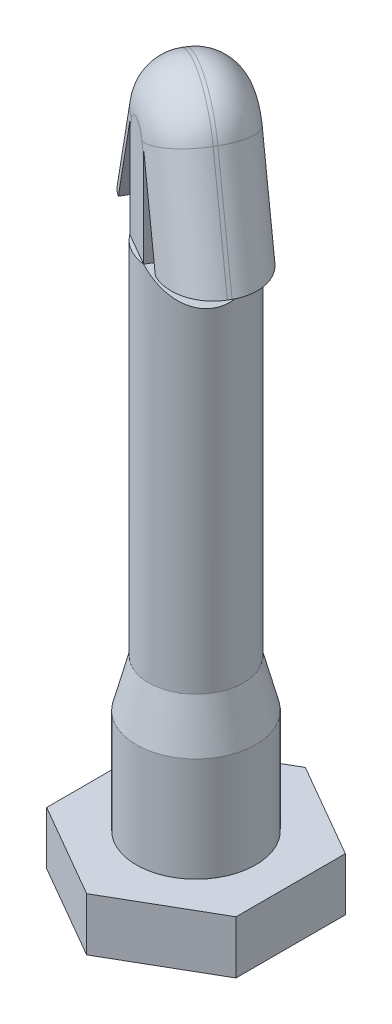
ISO-10303-21;
HEADER;
FILE_DESCRIPTION(('STEP AP214'),'2;1');
FILE_NAME('part.step','',(''),(''),'','','');
FILE_SCHEMA(('AUTOMOTIVE_DESIGN { 1 0 10303 214 1 1 1 1 }'));
ENDSEC;
DATA;
#1=APPLICATION_CONTEXT('core data for automotive mechanical design processes');
#2=APPLICATION_PROTOCOL_DEFINITION('international standard','automotive_design',2000,#1);
#3=PRODUCT_CONTEXT('',#1,'mechanical');
#4=PRODUCT('Part','Part','',(#3));
#5=PRODUCT_RELATED_PRODUCT_CATEGORY('part','',(#4));
#6=PRODUCT_DEFINITION_FORMATION('','',#4);
#7=PRODUCT_DEFINITION_CONTEXT('part definition',#1,'design');
#8=PRODUCT_DEFINITION('design','',#6,#7);
#9=PRODUCT_DEFINITION_SHAPE('','',#8);
#10=(LENGTH_UNIT() NAMED_UNIT(*) SI_UNIT(.MILLI.,.METRE.));
#11=(NAMED_UNIT(*) PLANE_ANGLE_UNIT() SI_UNIT($,.RADIAN.));
#12=(NAMED_UNIT(*) SI_UNIT($,.STERADIAN.) SOLID_ANGLE_UNIT());
#13=UNCERTAINTY_MEASURE_WITH_UNIT(LENGTH_MEASURE(1.E-05),#10,'distance_accuracy_value','');
#14=(GEOMETRIC_REPRESENTATION_CONTEXT(3) GLOBAL_UNCERTAINTY_ASSIGNED_CONTEXT((#13)) GLOBAL_UNIT_ASSIGNED_CONTEXT((#10,
#11,#12)) REPRESENTATION_CONTEXT('',''));
#15=CARTESIAN_POINT('',(0.,0.,0.));
#16=DIRECTION('',(0.,0.,1.));
#17=DIRECTION('',(1.,0.,0.));
#18=AXIS2_PLACEMENT_3D('',#15,#16,#17);
#19=CARTESIAN_POINT('',(-1.243518483893,18.013030214988,-0.665240668104));
#20=CARTESIAN_POINT('',(-0.74768379071,19.586072549946,-0.378970374521));
#21=CARTESIAN_POINT('',(0.702039866971,19.586072549947,0.458027969492));
#22=CARTESIAN_POINT('',(1.197874560154,18.013030214989,0.744298263075));
#23=CARTESIAN_POINT('',(-1.329912281867,18.013030214988,-0.515602220554));
#24=CARTESIAN_POINT('',(-0.834077588684,19.586072549946,-0.229331926971));
#25=CARTESIAN_POINT('',(0.615646068997,19.586072549947,0.607666417042));
#26=CARTESIAN_POINT('',(1.11148076218,18.013030214989,0.893936710625));
#27=CARTESIAN_POINT('',(-1.388704121136,18.001429181678,-0.350024613742));
#28=CARTESIAN_POINT('',(-0.904081622916,19.538900675009,-0.07022768393894));
#29=CARTESIAN_POINT('',(0.512859769797,19.538900675009,0.74784381057));
#30=CARTESIAN_POINT('',(0.997482268018,18.001429181678,1.027640740374));
#31=CARTESIAN_POINT('',(-1.41540483512,17.978210339228,-0.176191129849));
#32=CARTESIAN_POINT('',(-0.953222940369,19.444488711616,0.09064971150028));
#33=CARTESIAN_POINT('',(0.398106517178,19.444488711617,0.87084013758));
#34=CARTESIAN_POINT('',(0.86028841193,17.978210339228,1.137680978929));
#35=CARTESIAN_POINT('',(-1.408575383981,17.944625071374,-0.003470556097983));
#36=CARTESIAN_POINT('',(-0.978853060803,19.307925009702,0.244629742866));
#37=CARTESIAN_POINT('',(0.277570958556,19.307925009702,0.97002648866));
#38=CARTESIAN_POINT('',(0.707293281736,17.944625071374,1.218126787625));
#39=CARTESIAN_POINT('',(-1.331896233934,17.861049521113,0.322961134459));
#40=CARTESIAN_POINT('',(-0.982948212366,18.968091884571,0.524426368644));
#41=CARTESIAN_POINT('',(0.0373075485217,18.968091884572,1.113471306835));
#42=CARTESIAN_POINT('',(0.38625557009,17.861049521113,1.314936541021));
#43=CARTESIAN_POINT('',(-1.262045320192,17.811057914613,0.476677422943));
#44=CARTESIAN_POINT('',(-0.961413308377,18.764817077358,0.650247395892));
#45=CARTESIAN_POINT('',(-0.08242410939999,18.764817077358,1.157732046536));
#46=CARTESIAN_POINT('',(0.218207902416,17.811057914614,1.331302019485));
#47=CARTESIAN_POINT('',(-1.162611975944,17.755002670267,0.612474854904));
#48=CARTESIAN_POINT('',(-0.916156373372,18.536886434884,0.754766063392));
#49=CARTESIAN_POINT('',(-0.195568398127,18.536886434884,1.170797724875));
#50=CARTESIAN_POINT('',(0.05088720444517,17.755002670267,1.313088933364));
#51=CARTESIAN_POINT('',(-1.038955179358,17.695904895661,0.723034603054));
#52=CARTESIAN_POINT('',(-0.849616538094,18.296584320571,0.832349318556));
#53=CARTESIAN_POINT('',(-0.296027385646,18.296584320571,1.151964164742));
#54=CARTESIAN_POINT('',(-0.106688744382,17.695904895662,1.261278880244));
#55=CARTESIAN_POINT('',(-0.898341034409,17.63680805733,0.804218217492));
#56=CARTESIAN_POINT('',(-0.766118449561,18.056286013319,0.880556962447));
#57=CARTESIAN_POINT('',(-0.379525474179,18.056286013319,1.103756520851));
#58=CARTESIAN_POINT('',(-0.24730288933,17.63680805733,1.180095265806));
#59=(BOUNDED_SURFACE() B_SPLINE_SURFACE(5,3,((#19,#20,#21,#22),(#23,#24,#25,#26),(#27,#28,#29,
#30),(#31,#32,#33,#34),(#35,#36,#37,#38),(#39,#40,#41,#42),(#43,#44,#45,#46),(#47,#48,#49,#50),
(#51,#52,#53,#54),(#55,#56,#57,#58)),.UNSPECIFIED.,.F.,.F.,.F.) B_SPLINE_SURFACE_WITH_KNOTS((6,
4,6),(4,4),(0.,0.785398163397,1.570796326795),(0.,1.),
.UNSPECIFIED.) GEOMETRIC_REPRESENTATION_ITEM() RATIONAL_B_SPLINE_SURFACE(((1.,0.561346762217,
0.561346762217,1.),(1.,0.561346762217,0.561346762217,1.),(1.,0.561346762217,0.561346762217,1.),
(1.,0.561346762217,0.561346762217,1.),(1.,0.561346762217,0.561346762217,1.),(1.,0.561346762217,
0.561346762217,1.),(1.,0.561346762217,0.561346762217,1.),(1.,0.561346762217,0.561346762217,1.),
(1.,0.561346762217,0.561346762217,1.),(1.,0.561346762217,0.561346762217,1.))) REPRESENTATION_ITEM('') SURFACE());
#60=CARTESIAN_POINT('',(0.302697110669844,17.6368080573305,0.22746732164391));
#61=DIRECTION('',(0.296198132725968,-0.939692620785899,0.171010071662982));
#62=DIRECTION('',(0.953741925422963,0.300626578483174,0.));
#63=AXIS2_PLACEMENT_3D('',#60,#61,#62);
#64=CIRCLE('',#63,1.1);
#65=CARTESIAN_POINT('',(-0.247302889330205,17.6368080573302,1.1800952658062));
#66=VERTEX_POINT('',#65);
#67=CARTESIAN_POINT('',(1.19787456015422,18.013030214989,0.744298263077245));
#68=VERTEX_POINT('',#67);
#69=EDGE_CURVE('E115',#66,#68,#64,.F.);
#70=CARTESIAN_POINT('',(-0.0228219618684687,17.5,0.0395287974870595));
#71=DIRECTION('',(0.50000000000019,0.,-0.866025403784329));
#72=DIRECTION('',(-0.866025403784329,0.,-0.50000000000019));
#73=AXIS2_PLACEMENT_3D('',#70,#71,#72);
#74=CIRCLE('',#73,1.5);
#75=CARTESIAN_POINT('',(-1.24351848389239,18.0130302149888,-0.665240668102649));
#76=VERTEX_POINT('',#75);
#77=EDGE_CURVE('E118',#76,#68,#74,.T.);
#78=CARTESIAN_POINT('',(-0.348341034408943,17.6368080573302,-0.148409726670967));
#79=DIRECTION('',(0.296198132725968,0.939692620785899,0.171010071662982));
#80=DIRECTION('',(-0.953741925422963,0.300626578483174,0.));
#81=AXIS2_PLACEMENT_3D('',#78,#79,#80);
#82=CIRCLE('',#81,1.1);
#83=CARTESIAN_POINT('',(-0.898341034409258,17.6368080573301,0.80421821749172));
#84=VERTEX_POINT('',#83);
#85=EDGE_CURVE('E383',#76,#84,#82,.T.);
#86=CARTESIAN_POINT('',(-0.898341034409021,17.63680805733,0.804218217491988));
#87=CARTESIAN_POINT('',(-0.766118449561012,18.056286013319,0.880556962446992));
#88=CARTESIAN_POINT('',(-0.379525474178988,18.056286013319,1.10375652085101));
#89=CARTESIAN_POINT('',(-0.247302889329979,17.63680805733,1.18009526580601));
#90=(BOUNDED_CURVE() B_SPLINE_CURVE(3,(#86,#87,#88,#89),.UNSPECIFIED.,.F.,
.F.) B_SPLINE_CURVE_WITH_KNOTS((4,4),(0.,1.),
.UNSPECIFIED.) CURVE() GEOMETRIC_REPRESENTATION_ITEM() RATIONAL_B_SPLINE_CURVE((1.,
0.561346762217,0.561346762217,1.)) REPRESENTATION_ITEM(''));
#91=EDGE_CURVE('E122',#84,#66,#90,.T.);
#92=ORIENTED_EDGE('',*,*,#69,.T.);
#93=ORIENTED_EDGE('',*,*,#77,.F.);
#94=ORIENTED_EDGE('',*,*,#85,.T.);
#95=ORIENTED_EDGE('',*,*,#91,.T.);
#96=EDGE_LOOP('',(#92,#93,#94,#95));
#97=FACE_BOUND('',#96,.T.);
#98=ADVANCED_FACE('F17',(#97),#59,.T.);
#99=CARTESIAN_POINT('',(0.24730288933,17.63680805733,-1.180095265806));
#100=CARTESIAN_POINT('',(0.379525474179,18.056286013319,-1.10375652085));
#101=CARTESIAN_POINT('',(0.76611844956,18.056286013319,-0.880556962447));
#102=CARTESIAN_POINT('',(0.898341034409,17.63680805733,-0.804218217492));
#103=CARTESIAN_POINT('',(0.106688744383,17.695904895661,-1.261278880245));
#104=CARTESIAN_POINT('',(0.296027385647,18.296584320571,-1.151964164743));
#105=CARTESIAN_POINT('',(0.849616538094,18.29658432057,-0.832349318557));
#106=CARTESIAN_POINT('',(1.038955179358,17.695904895661,-0.723034603055));
#107=CARTESIAN_POINT('',(-0.05088720444476,17.755002670267,-1.313088933363));
#108=CARTESIAN_POINT('',(0.195568398127,18.536886434883,-1.170797724875));
#109=CARTESIAN_POINT('',(0.916156373372,18.536886434883,-0.754766063393));
#110=CARTESIAN_POINT('',(1.162611975944,17.755002670267,-0.612474854904));
#111=CARTESIAN_POINT('',(-0.218207902416,17.811057914613,-1.331302019486));
#112=CARTESIAN_POINT('',(0.08242410940032,18.764817077358,-1.157732046537));
#113=CARTESIAN_POINT('',(0.961413308377,18.764817077357,-0.650247395892));
#114=CARTESIAN_POINT('',(1.262045320192,17.811057914613,-0.476677422944));
#115=CARTESIAN_POINT('',(-0.38625557009,17.861049521113,-1.314936541021));
#116=CARTESIAN_POINT('',(-0.03730754852147,18.968091884572,-1.113471306836));
#117=CARTESIAN_POINT('',(0.982948212367,18.968091884571,-0.524426368644));
#118=CARTESIAN_POINT('',(1.331896233934,17.861049521113,-0.322961134459));
#119=CARTESIAN_POINT('',(-0.707293281736,17.944625071374,-1.218126787625));
#120=CARTESIAN_POINT('',(-0.277570958556,19.307925009702,-0.97002648866));
#121=CARTESIAN_POINT('',(0.978853060803,19.307925009701,-0.244629742867));
#122=CARTESIAN_POINT('',(1.408575383981,17.944625071373,0.003470556097655));
#123=CARTESIAN_POINT('',(-0.860288411929,17.978210339228,-1.137680978929));
#124=CARTESIAN_POINT('',(-0.398106517178,19.444488711616,-0.87084013758));
#125=CARTESIAN_POINT('',(0.95322294037,19.444488711616,-0.09064971150063));
#126=CARTESIAN_POINT('',(1.41540483512,17.978210339227,0.176191129848));
#127=CARTESIAN_POINT('',(-0.997482268017,18.001429181678,-1.027640740375));
#128=CARTESIAN_POINT('',(-0.512859769796,19.538900675009,-0.747843810571));
#129=CARTESIAN_POINT('',(0.904081622917,19.538900675009,0.07022768393817));
#130=CARTESIAN_POINT('',(1.388704121137,18.001429181677,0.350024613741));
#131=CARTESIAN_POINT('',(-1.11148076218,18.013030214989,-0.893936710626));
#132=CARTESIAN_POINT('',(-0.615646068996,19.586072549947,-0.607666417043));
#133=CARTESIAN_POINT('',(0.834077588685,19.586072549946,0.229331926971));
#134=CARTESIAN_POINT('',(1.329912281867,18.013030214988,0.515602220553));
#135=CARTESIAN_POINT('',(-1.197874560154,18.013030214989,-0.744298263076));
#136=CARTESIAN_POINT('',(-0.702039866971,19.586072549947,-0.458027969493));
#137=CARTESIAN_POINT('',(0.747683790711,19.586072549947,0.378970374521));
#138=CARTESIAN_POINT('',(1.243518483893,18.013030214988,0.665240668103));
#139=(BOUNDED_SURFACE() B_SPLINE_SURFACE(5,3,((#99,#100,#101,#102),(#103,#104,#105,#106),(#107,
#108,#109,#110),(#111,#112,#113,#114),(#115,#116,#117,#118),(#119,#120,#121,#122),(#123,#124,
#125,#126),(#127,#128,#129,#130),(#131,#132,#133,#134),(#135,#136,#137,#138)),.UNSPECIFIED.,.F.,
.F.,.F.) B_SPLINE_SURFACE_WITH_KNOTS((6,4,6),(4,4),(4.712388980385,5.497787143782,
6.28318530718),(0.,1.),
.UNSPECIFIED.) GEOMETRIC_REPRESENTATION_ITEM() RATIONAL_B_SPLINE_SURFACE(((1.,0.561346762217,
0.561346762217,1.),(1.,0.561346762217,0.561346762217,1.),(1.,0.561346762217,0.561346762217,1.),
(1.,0.561346762217,0.561346762217,1.),(1.,0.561346762217,0.561346762217,1.),(1.,0.561346762217,
0.561346762217,1.),(1.,0.561346762217,0.561346762217,1.),(1.,0.561346762217,0.561346762217,1.),
(1.,0.561346762217,0.561346762217,1.),(1.,0.561346762217,0.561346762217,1.))) REPRESENTATION_ITEM('') SURFACE());
#140=CARTESIAN_POINT('',(0.348341034408943,17.6368080573302,0.148409726670967));
#141=DIRECTION('',(-0.296198132725968,0.939692620785899,-0.171010071662982));
#142=DIRECTION('',(-0.953741925422963,-0.300626578483174,0.));
#143=AXIS2_PLACEMENT_3D('',#140,#141,#142);
#144=CIRCLE('',#143,1.1);
#145=CARTESIAN_POINT('',(1.24351848389397,18.0130302149885,0.665240668103452));
#146=VERTEX_POINT('',#145);
#147=CARTESIAN_POINT('',(0.898341034409258,17.6368080573301,-0.80421821749172));
#148=VERTEX_POINT('',#147);
#149=EDGE_CURVE('E375',#146,#148,#144,.T.);
#150=CARTESIAN_POINT('',(0.898341034409,17.63680805733,-0.804218217492));
#151=CARTESIAN_POINT('',(0.76611844956,18.056286013319,-0.880556962447));
#152=CARTESIAN_POINT('',(0.379525474179,18.056286013319,-1.10375652085));
#153=CARTESIAN_POINT('',(0.24730288933,17.63680805733,-1.180095265806));
#154=(BOUNDED_CURVE() B_SPLINE_CURVE(3,(#150,#151,#152,#153),.UNSPECIFIED.,.F.,
.F.) B_SPLINE_CURVE_WITH_KNOTS((4,4),(0.,1.),
.UNSPECIFIED.) CURVE() GEOMETRIC_REPRESENTATION_ITEM() RATIONAL_B_SPLINE_CURVE((1.,
0.561346762217,0.561346762217,1.)) REPRESENTATION_ITEM(''));
#155=CARTESIAN_POINT('',(0.247302889330239,17.6368080573303,-1.18009526580618));
#156=VERTEX_POINT('',#155);
#157=EDGE_CURVE('E188',#148,#156,#154,.T.);
#158=CARTESIAN_POINT('',(-0.302697110669756,17.6368080573308,-0.227467321643859));
#159=DIRECTION('',(-0.296198132725968,-0.939692620785899,-0.171010071662982));
#160=DIRECTION('',(0.953741925422963,-0.300626578483174,0.));
#161=AXIS2_PLACEMENT_3D('',#158,#159,#160);
#162=CIRCLE('',#161,1.1);
#163=CARTESIAN_POINT('',(-1.19787456015307,18.0130302149889,-0.744298263076785));
#164=VERTEX_POINT('',#163);
#165=EDGE_CURVE('E128',#156,#164,#162,.F.);
#166=CARTESIAN_POINT('',(0.0228219618708778,17.5,-0.0395287974862485));
#167=DIRECTION('',(0.50000000000019,0.,-0.866025403784329));
#168=DIRECTION('',(-0.866025403784329,0.,-0.50000000000019));
#169=AXIS2_PLACEMENT_3D('',#166,#167,#168);
#170=CIRCLE('',#169,1.5);
#171=EDGE_CURVE('E138',#146,#164,#170,.F.);
#172=ORIENTED_EDGE('',*,*,#149,.T.);
#173=ORIENTED_EDGE('',*,*,#157,.T.);
#174=ORIENTED_EDGE('',*,*,#165,.T.);
#175=ORIENTED_EDGE('',*,*,#171,.F.);
#176=EDGE_LOOP('',(#172,#173,#174,#175));
#177=FACE_BOUND('',#176,.T.);
#178=ADVANCED_FACE('F199',(#177),#139,.T.);
#179=CARTESIAN_POINT('',(-3.660122852247,17.5,6.339518742035));
#180=DIRECTION('',(0.50000000000019,0.,-0.866025403784329));
#181=DIRECTION('',(-0.866025403784329,0.,-0.50000000000019));
#182=AXIS2_PLACEMENT_3D('',#179,#180,#181);
#183=CYLINDRICAL_SURFACE('',#182,1.5);
#184=DIRECTION('',(0.500000000000209,0.,-0.866025403784318));
#185=VECTOR('',#184,1.);
#186=CARTESIAN_POINT('',(-2.43942633022308,18.0130302149893,7.04428820762395));
#187=LINE('',#186,#185);
#188=EDGE_CURVE('E135',#146,#68,#187,.F.);
#189=ORIENTED_EDGE('',*,*,#188,.F.);
#190=ORIENTED_EDGE('',*,*,#171,.T.);
#191=DIRECTION('',(0.50000000000019,0.,-0.866025403784329));
#192=VECTOR('',#191,1.);
#193=CARTESIAN_POINT('',(-4.88081937427085,18.0130302149887,5.63474927644533));
#194=LINE('',#193,#192);
#195=EDGE_CURVE('E137',#164,#76,#194,.F.);
#196=ORIENTED_EDGE('',*,*,#195,.T.);
#197=ORIENTED_EDGE('',*,*,#77,.T.);
#198=EDGE_LOOP('',(#189,#190,#196,#197));
#199=FACE_BOUND('',#198,.T.);
#200=ADVANCED_FACE('F133',(#199),#183,.T.);
#201=CARTESIAN_POINT('',(-2.439426330223,18.013030214989,7.044288207624));
#202=DIRECTION('',(0.813797681349138,0.342020143326058,0.46984631039308));
#203=DIRECTION('',(0.500000000000209,0.,-0.866025403784318));
#204=AXIS2_PLACEMENT_3D('',#201,#202,#203);
#205=PLANE('',#204);
#206=DIRECTION('',(-0.499999999998796,0.,0.866025403785134));
#207=VECTOR('',#206,1.);
#208=CARTESIAN_POINT('',(2.130206618449,15.2,1.177170301279));
#209=LINE('',#208,#207);
#210=CARTESIAN_POINT('',(2.13020661845042,15.2,1.17717030127643));
#211=VERTEX_POINT('',#210);
#212=CARTESIAN_POINT('',(2.0845626947108,15.2,1.25622789625051));
#213=VERTEX_POINT('',#212);
#214=EDGE_CURVE('E155',#211,#213,#209,.T.);
#215=ORIENTED_EDGE('',*,*,#214,.F.);
#216=DIRECTION('',(-0.296198132725968,0.939692620785899,-0.171010071662982));
#217=VECTOR('',#216,1.);
#218=CARTESIAN_POINT('',(1.24351848389358,18.0130302149883,0.665240668102759));
#219=LINE('',#218,#217);
#220=EDGE_CURVE('E145',#146,#211,#219,.F.);
#221=ORIENTED_EDGE('',*,*,#220,.F.);
#222=ORIENTED_EDGE('',*,*,#188,.T.);
#223=DIRECTION('',(0.296198132725968,-0.939692620785899,0.171010071662982));
#224=VECTOR('',#223,1.);
#225=CARTESIAN_POINT('',(1.19787456015333,18.0130302149883,0.744298263077924));
#226=LINE('',#225,#224);
#227=EDGE_CURVE('E142',#213,#68,#226,.F.);
#228=ORIENTED_EDGE('',*,*,#227,.F.);
#229=EDGE_LOOP('',(#215,#221,#222,#228));
#230=FACE_BOUND('',#229,.T.);
#231=ADVANCED_FACE('F141',(#230),#205,.T.);
#232=CARTESIAN_POINT('',(-4.880819374271,18.013030214989,5.634749276446));
#233=DIRECTION('',(0.813797681349138,-0.342020143326058,0.46984631039308));
#234=DIRECTION('',(0.500000000000209,0.,-0.866025403784318));
#235=AXIS2_PLACEMENT_3D('',#232,#233,#234);
#236=PLANE('',#235);
#237=DIRECTION('',(0.499999999998796,0.,-0.866025403785134));
#238=VECTOR('',#237,1.);
#239=CARTESIAN_POINT('',(-2.130206618449,15.2,-1.177170301279));
#240=LINE('',#239,#238);
#241=CARTESIAN_POINT('',(-2.13020661845032,15.2,-1.17717030127653));
#242=VERTEX_POINT('',#241);
#243=CARTESIAN_POINT('',(-2.0845626947108,15.2,-1.25622789625051));
#244=VERTEX_POINT('',#243);
#245=EDGE_CURVE('E174',#242,#244,#240,.T.);
#246=ORIENTED_EDGE('',*,*,#245,.F.);
#247=DIRECTION('',(0.29619813272632,0.939692620785767,0.1710100716631));
#248=VECTOR('',#247,1.);
#249=CARTESIAN_POINT('',(-1.243518483892,18.013030214989,-0.665240668102429));
#250=LINE('',#249,#248);
#251=EDGE_CURVE('E146',#76,#242,#250,.F.);
#252=ORIENTED_EDGE('',*,*,#251,.F.);
#253=ORIENTED_EDGE('',*,*,#195,.F.);
#254=DIRECTION('',(-0.296198132725968,-0.939692620785899,-0.171010071662982));
#255=VECTOR('',#254,1.);
#256=CARTESIAN_POINT('',(-1.19787456015333,18.0130302149883,-0.744298263077924));
#257=LINE('',#256,#255);
#258=EDGE_CURVE('E166',#244,#164,#257,.F.);
#259=ORIENTED_EDGE('',*,*,#258,.F.);
#260=EDGE_LOOP('',(#246,#252,#253,#259));
#261=FACE_BOUND('',#260,.T.);
#262=ADVANCED_FACE('F219',(#261),#236,.F.);
#263=CARTESIAN_POINT('',(0.30269711067,17.63680805733,0.227467321644));
#264=DIRECTION('',(0.296198132725968,-0.939692620785899,0.171010071662982));
#265=DIRECTION('',(0.953741925422963,0.300626578483174,0.));
#266=AXIS2_PLACEMENT_3D('',#263,#264,#265);
#267=CYLINDRICAL_SURFACE('',#266,1.1);
#268=ORIENTED_EDGE('',*,*,#69,.F.);
#269=DIRECTION('',(0.296198132725968,-0.939692620785899,0.171010071662982));
#270=VECTOR('',#269,1.);
#271=CARTESIAN_POINT('',(-0.247302889330388,17.63680805733,1.18009526580666));
#272=LINE('',#271,#270);
#273=CARTESIAN_POINT('',(-0.13980925997783,17.2957830503376,1.24215674164933));
#274=VERTEX_POINT('',#273);
#275=EDGE_CURVE('E152',#66,#274,#272,.T.);
#276=ORIENTED_EDGE('',*,*,#275,.T.);
#277=CARTESIAN_POINT('',(0.410190740022263,17.2957830503383,0.289528797486764));
#278=DIRECTION('',(-0.866025403784329,0.,-0.50000000000019));
#279=DIRECTION('',(0.,-1.,0.));
#280=AXIS2_PLACEMENT_3D('',#277,#278,#279);
#281=ELLIPSE('',#280,3.21618484017916,1.1);
#282=CARTESIAN_POINT('',(-0.138699388538257,17.5000000000046,1.24023438792612));
#283=VERTEX_POINT('',#282);
#284=EDGE_CURVE('E153',#274,#283,#281,.T.);
#285=ORIENTED_EDGE('',*,*,#284,.T.);
#286=DIRECTION('',(-0.29619813272632,0.939692620785767,-0.1710100716631));
#287=VECTOR('',#286,1.);
#288=CARTESIAN_POINT('',(-0.138699388536196,17.5,1.24023438792704));
#289=LINE('',#288,#287);
#290=CARTESIAN_POINT('',(0.586277790385084,15.2,1.6588001573341));
#291=VERTEX_POINT('',#290);
#292=EDGE_CURVE('E160',#283,#291,#289,.F.);
#293=ORIENTED_EDGE('',*,*,#292,.T.);
#294=CARTESIAN_POINT('',(1.07079721109336,15.2,0.670930121388471));
#295=DIRECTION('',(0.,-1.,0.));
#296=DIRECTION('',(0.866025403784212,0.,0.500000000000393));
#297=AXIS2_PLACEMENT_3D('',#294,#295,#296);
#298=ELLIPSE('',#297,1.17059554972352,1.1);
#299=EDGE_CURVE('E150',#213,#291,#298,.T.);
#300=ORIENTED_EDGE('',*,*,#299,.F.);
#301=ORIENTED_EDGE('',*,*,#227,.T.);
#302=EDGE_LOOP('',(#268,#276,#285,#293,#300,#301));
#303=FACE_BOUND('',#302,.T.);
#304=ADVANCED_FACE('F148',(#303),#267,.T.);
#305=CARTESIAN_POINT('',(-1.552738195666,15.2,7.556217840798));
#306=DIRECTION('',(0.,-1.,0.));
#307=DIRECTION('',(0.,0.,-1.));
#308=AXIS2_PLACEMENT_3D('',#305,#306,#307);
#309=PLANE('',#308);
#310=DIRECTION('',(0.500000000000209,0.,-0.866025403784318));
#311=VECTOR('',#310,1.);
#312=CARTESIAN_POINT('',(-2.5021329714326,15.2,7.00808451144184));
#313=LINE('',#312,#311);
#314=CARTESIAN_POINT('',(1.72970197124536,15.2,-0.321668618517613));
#315=VERTEX_POINT('',#314);
#316=EDGE_CURVE('E359',#291,#315,#313,.T.);
#317=ORIENTED_EDGE('',*,*,#316,.T.);
#318=CARTESIAN_POINT('',(1.11644113483236,15.2,0.591872526415472));
#319=DIRECTION('',(0.,-1.,0.));
#320=DIRECTION('',(-0.866025403784212,0.,-0.500000000000393));
#321=AXIS2_PLACEMENT_3D('',#318,#319,#320);
#322=ELLIPSE('',#321,1.17059554972352,1.1);
#323=EDGE_CURVE('E368',#211,#315,#322,.F.);
#324=ORIENTED_EDGE('',*,*,#323,.F.);
#325=ORIENTED_EDGE('',*,*,#214,.T.);
#326=ORIENTED_EDGE('',*,*,#299,.T.);
#327=EDGE_LOOP('',(#317,#324,#325,#326));
#328=FACE_BOUND('',#327,.T.);
#329=ADVANCED_FACE('F225',(#328),#309,.T.);
#330=CARTESIAN_POINT('',(0.348341034409,17.63680805733,0.148409726671));
#331=DIRECTION('',(-0.296198132725968,0.939692620785899,-0.171010071662982));
#332=DIRECTION('',(-0.953741925422963,-0.300626578483174,0.));
#333=AXIS2_PLACEMENT_3D('',#330,#331,#332);
#334=CYLINDRICAL_SURFACE('',#333,1.1);
#335=ORIENTED_EDGE('',*,*,#149,.F.);
#336=ORIENTED_EDGE('',*,*,#220,.T.);
#337=ORIENTED_EDGE('',*,*,#323,.T.);
#338=DIRECTION('',(-0.29619813272632,0.939692620785767,-0.1710100716631));
#339=VECTOR('',#338,1.);
#340=CARTESIAN_POINT('',(1.00472479232403,17.5,-0.740234387924594));
#341=LINE('',#340,#339);
#342=CARTESIAN_POINT('',(1.00472479232204,17.5000000000047,-0.740234387925738));
#343=VERTEX_POINT('',#342);
#344=EDGE_CURVE('E340',#315,#343,#341,.T.);
#345=ORIENTED_EDGE('',*,*,#344,.T.);
#346=CARTESIAN_POINT('',(0.45583466376139,17.2957830503378,0.210471202513837));
#347=DIRECTION('',(-0.866025403784329,0.,-0.50000000000019));
#348=DIRECTION('',(0.,1.,0.));
#349=AXIS2_PLACEMENT_3D('',#346,#347,#348);
#350=ELLIPSE('',#349,3.21618484017916,1.1);
#351=CARTESIAN_POINT('',(1.00583466376163,17.2957830503392,-0.742156741648982));
#352=VERTEX_POINT('',#351);
#353=EDGE_CURVE('E181',#343,#352,#350,.T.);
#354=ORIENTED_EDGE('',*,*,#353,.T.);
#355=DIRECTION('',(-0.296198132725968,0.939692620785899,-0.171010071662982));
#356=VECTOR('',#355,1.);
#357=CARTESIAN_POINT('',(0.898341034409792,17.6368080573302,-0.804218217491426));
#358=LINE('',#357,#356);
#359=EDGE_CURVE('E178',#352,#148,#358,.T.);
#360=ORIENTED_EDGE('',*,*,#359,.T.);
#361=EDGE_LOOP('',(#335,#336,#337,#345,#354,#360));
#362=FACE_BOUND('',#361,.T.);
#363=ADVANCED_FACE('F228',(#362),#334,.T.);
#364=CARTESIAN_POINT('',(0.,0.,0.));
#365=DIRECTION('',(0.,1.,0.));
#366=DIRECTION('',(0.,0.,1.));
#367=AXIS2_PLACEMENT_3D('',#364,#365,#366);
#368=PLANE('',#367);
#369=DIRECTION('',(-0.866025403784329,0.,0.50000000000019));
#370=VECTOR('',#369,1.);
#371=CARTESIAN_POINT('',(0.,0.,2.886751345948));
#372=LINE('',#371,#370);
#373=CARTESIAN_POINT('',(2.49999999999991,0.,1.44337567297385));
#374=VERTEX_POINT('',#373);
#375=CARTESIAN_POINT('',(-2.39138479785729E-13,0.,2.88675134594815));
#376=VERTEX_POINT('',#375);
#377=EDGE_CURVE('E337',#374,#376,#372,.T.);
#378=ORIENTED_EDGE('',*,*,#377,.T.);
#379=DIRECTION('',(-0.866025403784329,0.,-0.50000000000019));
#380=VECTOR('',#379,1.);
#381=CARTESIAN_POINT('',(-2.5,0.,1.443375672974));
#382=LINE('',#381,#380);
#383=CARTESIAN_POINT('',(-2.5,0.,1.443375672974));
#384=VERTEX_POINT('',#383);
#385=EDGE_CURVE('E310',#376,#384,#382,.T.);
#386=ORIENTED_EDGE('',*,*,#385,.T.);
#387=DIRECTION('',(0.,0.,-1.));
#388=VECTOR('',#387,1.);
#389=CARTESIAN_POINT('',(-2.5,0.,-1.443375672974));
#390=LINE('',#389,#388);
#391=CARTESIAN_POINT('',(-2.49999999999991,0.,-1.44337567297385));
#392=VERTEX_POINT('',#391);
#393=EDGE_CURVE('E316',#384,#392,#390,.T.);
#394=ORIENTED_EDGE('',*,*,#393,.T.);
#395=DIRECTION('',(0.866025403784329,0.,-0.50000000000019));
#396=VECTOR('',#395,1.);
#397=CARTESIAN_POINT('',(0.,0.,-2.886751345948));
#398=LINE('',#397,#396);
#399=CARTESIAN_POINT('',(2.37865927896582E-13,0.,-2.88675134594815));
#400=VERTEX_POINT('',#399);
#401=EDGE_CURVE('E322',#392,#400,#398,.T.);
#402=ORIENTED_EDGE('',*,*,#401,.T.);
#403=DIRECTION('',(0.866025403784329,0.,0.50000000000019));
#404=VECTOR('',#403,1.);
#405=CARTESIAN_POINT('',(2.5,0.,-1.443375672974));
#406=LINE('',#405,#404);
#407=CARTESIAN_POINT('',(2.5,0.,-1.443375672974));
#408=VERTEX_POINT('',#407);
#409=EDGE_CURVE('E328',#400,#408,#406,.T.);
#410=ORIENTED_EDGE('',*,*,#409,.T.);
#411=DIRECTION('',(0.,0.,1.));
#412=VECTOR('',#411,1.);
#413=CARTESIAN_POINT('',(2.5,0.,1.443375672974));
#414=LINE('',#413,#412);
#415=EDGE_CURVE('E334',#408,#374,#414,.T.);
#416=ORIENTED_EDGE('',*,*,#415,.T.);
#417=EDGE_LOOP('',(#378,#386,#394,#402,#410,#416));
#418=FACE_BOUND('',#417,.T.);
#419=ADVANCED_FACE('F232',(#418),#368,.F.);
#420=CARTESIAN_POINT('',(-0.348341034409,17.63680805733,-0.148409726671));
#421=DIRECTION('',(0.296198132725968,0.939692620785899,0.171010071662982));
#422=DIRECTION('',(-0.953741925422963,0.300626578483174,0.));
#423=AXIS2_PLACEMENT_3D('',#420,#421,#422);
#424=CYLINDRICAL_SURFACE('',#423,1.1);
#425=DIRECTION('',(0.296198132725968,0.939692620785899,0.171010071662982));
#426=VECTOR('',#425,1.);
#427=CARTESIAN_POINT('',(-0.898341034409792,17.6368080573302,0.804218217491425));
#428=LINE('',#427,#426);
#429=CARTESIAN_POINT('',(-1.00583466376163,17.2957830503392,0.742156741648982));
#430=VERTEX_POINT('',#429);
#431=EDGE_CURVE('E171',#430,#84,#428,.T.);
#432=ORIENTED_EDGE('',*,*,#431,.T.);
#433=ORIENTED_EDGE('',*,*,#85,.F.);
#434=ORIENTED_EDGE('',*,*,#251,.T.);
#435=CARTESIAN_POINT('',(-1.11644113483236,15.2,-0.591872526415472));
#436=DIRECTION('',(0.,-1.,0.));
#437=DIRECTION('',(0.866025403784212,0.,0.500000000000393));
#438=AXIS2_PLACEMENT_3D('',#435,#436,#437);
#439=ELLIPSE('',#438,1.17059554972352,1.1);
#440=CARTESIAN_POINT('',(-1.72970197124226,15.2000000000001,0.321668618519643));
#441=VERTEX_POINT('',#440);
#442=EDGE_CURVE('E355',#441,#242,#439,.T.);
#443=ORIENTED_EDGE('',*,*,#442,.F.);
#444=DIRECTION('',(0.29619813272632,0.939692620785767,0.1710100716631));
#445=VECTOR('',#444,1.);
#446=CARTESIAN_POINT('',(-1.00472479232095,17.5,0.740234387926606));
#447=LINE('',#446,#445);
#448=CARTESIAN_POINT('',(-1.00472479232212,17.4999999999971,0.740234387925872));
#449=VERTEX_POINT('',#448);
#450=EDGE_CURVE('E306',#449,#441,#447,.F.);
#451=ORIENTED_EDGE('',*,*,#450,.F.);
#452=CARTESIAN_POINT('',(-0.45583466376139,17.2957830503378,-0.210471202513837));
#453=DIRECTION('',(0.866025403784329,0.,0.50000000000019));
#454=DIRECTION('',(0.,1.,0.));
#455=AXIS2_PLACEMENT_3D('',#452,#453,#454);
#456=ELLIPSE('',#455,3.21618484017916,1.1);
#457=EDGE_CURVE('E175',#449,#430,#456,.T.);
#458=ORIENTED_EDGE('',*,*,#457,.T.);
#459=EDGE_LOOP('',(#432,#433,#434,#443,#451,#458));
#460=FACE_BOUND('',#459,.T.);
#461=ADVANCED_FACE('F236',(#460),#424,.T.);
#462=CARTESIAN_POINT('',(-4.818112733059,15.2,5.670952972629));
#463=DIRECTION('',(0.,-1.,0.));
#464=DIRECTION('',(0.,0.,-1.));
#465=AXIS2_PLACEMENT_3D('',#462,#463,#464);
#466=PLANE('',#465);
#467=DIRECTION('',(0.500000000000209,0.,-0.866025403784318));
#468=VECTOR('',#467,1.);
#469=CARTESIAN_POINT('',(-4.81811273306037,15.2000000000001,5.67095297262818));
#470=LINE('',#469,#468);
#471=CARTESIAN_POINT('',(-0.586277790381834,15.2000000000001,-1.65880015733234));
#472=VERTEX_POINT('',#471);
#473=EDGE_CURVE('E344',#441,#472,#470,.T.);
#474=ORIENTED_EDGE('',*,*,#473,.F.);
#475=ORIENTED_EDGE('',*,*,#442,.T.);
#476=ORIENTED_EDGE('',*,*,#245,.T.);
#477=CARTESIAN_POINT('',(-1.07079721109336,15.2,-0.670930121388471));
#478=DIRECTION('',(0.,-1.,0.));
#479=DIRECTION('',(-0.866025403784212,0.,-0.500000000000393));
#480=AXIS2_PLACEMENT_3D('',#477,#478,#479);
#481=ELLIPSE('',#480,1.17059554972352,1.1);
#482=EDGE_CURVE('E343',#472,#244,#481,.F.);
#483=ORIENTED_EDGE('',*,*,#482,.F.);
#484=EDGE_LOOP('',(#474,#475,#476,#483));
#485=FACE_BOUND('',#484,.T.);
#486=ADVANCED_FACE('F240',(#485),#466,.T.);
#487=CARTESIAN_POINT('',(-0.30269711067,17.63680805733,-0.227467321644));
#488=DIRECTION('',(-0.296198132725968,-0.939692620785899,-0.171010071662982));
#489=DIRECTION('',(0.953741925422963,-0.300626578483174,0.));
#490=AXIS2_PLACEMENT_3D('',#487,#488,#489);
#491=CYLINDRICAL_SURFACE('',#490,1.1);
#492=CARTESIAN_POINT('',(-0.410190740022263,17.2957830503383,-0.289528797486764));
#493=DIRECTION('',(0.866025403784329,0.,0.50000000000019));
#494=DIRECTION('',(0.,-1.,0.));
#495=AXIS2_PLACEMENT_3D('',#492,#493,#494);
#496=ELLIPSE('',#495,3.21618484017916,1.1);
#497=CARTESIAN_POINT('',(0.139809259977767,17.2957830503376,-1.24215674164922));
#498=VERTEX_POINT('',#497);
#499=CARTESIAN_POINT('',(0.138699388538279,17.499999999997,-1.24023438792615));
#500=VERTEX_POINT('',#499);
#501=EDGE_CURVE('E165',#498,#500,#496,.T.);
#502=ORIENTED_EDGE('',*,*,#501,.T.);
#503=DIRECTION('',(0.29619813272632,0.939692620785767,0.1710100716631));
#504=VECTOR('',#503,1.);
#505=CARTESIAN_POINT('',(0.138699388539369,17.5,-1.24023438792518));
#506=LINE('',#505,#504);
#507=EDGE_CURVE('E302',#472,#500,#506,.T.);
#508=ORIENTED_EDGE('',*,*,#507,.F.);
#509=ORIENTED_EDGE('',*,*,#482,.T.);
#510=ORIENTED_EDGE('',*,*,#258,.T.);
#511=ORIENTED_EDGE('',*,*,#165,.F.);
#512=DIRECTION('',(-0.296198132725968,-0.939692620785899,-0.171010071662982));
#513=VECTOR('',#512,1.);
#514=CARTESIAN_POINT('',(0.247302889330388,17.63680805733,-1.18009526580666));
#515=LINE('',#514,#513);
#516=EDGE_CURVE('E162',#156,#498,#515,.T.);
#517=ORIENTED_EDGE('',*,*,#516,.T.);
#518=EDGE_LOOP('',(#502,#508,#509,#510,#511,#517));
#519=FACE_BOUND('',#518,.T.);
#520=ADVANCED_FACE('F244',(#519),#491,.T.);
#521=CARTESIAN_POINT('',(-3.227110150354,17.5,6.589518742035));
#522=DIRECTION('',(0.813797681349138,0.342020143326058,0.46984631039308));
#523=DIRECTION('',(0.500000000000209,0.,-0.866025403784318));
#524=AXIS2_PLACEMENT_3D('',#521,#522,#523);
#525=PLANE('',#524);
#526=ORIENTED_EDGE('',*,*,#316,.F.);
#527=ORIENTED_EDGE('',*,*,#292,.F.);
#528=DIRECTION('',(-0.50000000000019,0.,0.866025403784329));
#529=VECTOR('',#528,1.);
#530=CARTESIAN_POINT('',(0.433012701892,17.500000000003,0.25));
#531=LINE('',#530,#529);
#532=EDGE_CURVE('E363',#283,#343,#531,.F.);
#533=ORIENTED_EDGE('',*,*,#532,.T.);
#534=ORIENTED_EDGE('',*,*,#344,.F.);
#535=EDGE_LOOP('',(#526,#527,#533,#534));
#536=FACE_BOUND('',#535,.T.);
#537=ADVANCED_FACE('F248',(#536),#525,.F.);
#538=CARTESIAN_POINT('',(0.,1.4,2.886751345948));
#539=DIRECTION('',(-0.50000000000019,0.,-0.866025403784329));
#540=DIRECTION('',(-0.866025403784329,0.,0.50000000000019));
#541=AXIS2_PLACEMENT_3D('',#538,#539,#540);
#542=PLANE('',#541);
#543=DIRECTION('',(0.866025403784463,0.,-0.499999999999957));
#544=VECTOR('',#543,1.);
#545=CARTESIAN_POINT('',(-1.742683153112E-13,1.4,2.886751345948));
#546=LINE('',#545,#544);
#547=CARTESIAN_POINT('',(-2.28199589265839E-13,1.4,2.88675134594817));
#548=VERTEX_POINT('',#547);
#549=CARTESIAN_POINT('',(2.49999999999983,1.4,1.4433756729737));
#550=VERTEX_POINT('',#549);
#551=EDGE_CURVE('E365',#548,#550,#546,.T.);
#552=ORIENTED_EDGE('',*,*,#551,.F.);
#553=DIRECTION('',(0.,1.,0.));
#554=VECTOR('',#553,1.);
#555=CARTESIAN_POINT('',(-4.75314232417645E-13,1.4,2.88675134594852));
#556=LINE('',#555,#554);
#557=EDGE_CURVE('E303',#548,#376,#556,.F.);
#558=ORIENTED_EDGE('',*,*,#557,.T.);
#559=ORIENTED_EDGE('',*,*,#377,.F.);
#560=DIRECTION('',(0.,1.,0.));
#561=VECTOR('',#560,1.);
#562=CARTESIAN_POINT('',(2.5,1.4,1.443375672974));
#563=LINE('',#562,#561);
#564=EDGE_CURVE('E331',#374,#550,#563,.T.);
#565=ORIENTED_EDGE('',*,*,#564,.T.);
#566=EDGE_LOOP('',(#552,#558,#559,#565));
#567=FACE_BOUND('',#566,.T.);
#568=ADVANCED_FACE('F252',(#567),#542,.F.);
#569=CARTESIAN_POINT('',(2.5,1.4,1.443375672974));
#570=DIRECTION('',(-1.,0.,0.));
#571=DIRECTION('',(0.,0.,1.));
#572=AXIS2_PLACEMENT_3D('',#569,#570,#571);
#573=PLANE('',#572);
#574=DIRECTION('',(0.,0.,1.));
#575=VECTOR('',#574,1.);
#576=CARTESIAN_POINT('',(2.5,1.4,0.));
#577=LINE('',#576,#575);
#578=CARTESIAN_POINT('',(2.5,1.4,-1.443375672974));
#579=VERTEX_POINT('',#578);
#580=EDGE_CURVE('E475',#550,#579,#577,.F.);
#581=ORIENTED_EDGE('',*,*,#580,.F.);
#582=ORIENTED_EDGE('',*,*,#564,.F.);
#583=ORIENTED_EDGE('',*,*,#415,.F.);
#584=DIRECTION('',(0.,1.,0.));
#585=VECTOR('',#584,1.);
#586=CARTESIAN_POINT('',(2.5,1.4,-1.443375672974));
#587=LINE('',#586,#585);
#588=EDGE_CURVE('E325',#408,#579,#587,.T.);
#589=ORIENTED_EDGE('',*,*,#588,.T.);
#590=EDGE_LOOP('',(#581,#582,#583,#589));
#591=FACE_BOUND('',#590,.T.);
#592=ADVANCED_FACE('F256',(#591),#573,.F.);
#593=CARTESIAN_POINT('',(2.5,1.4,-1.443375672974));
#594=DIRECTION('',(-0.50000000000019,0.,0.866025403784329));
#595=DIRECTION('',(0.866025403784329,0.,0.50000000000019));
#596=AXIS2_PLACEMENT_3D('',#593,#594,#595);
#597=PLANE('',#596);
#598=DIRECTION('',(-0.866025403784433,0.,-0.500000000000009));
#599=VECTOR('',#598,1.);
#600=CARTESIAN_POINT('',(2.5,1.4,-1.443375672974));
#601=LINE('',#600,#599);
#602=CARTESIAN_POINT('',(3.12504060223541E-13,1.4,-2.88675134594828));
#603=VERTEX_POINT('',#602);
#604=EDGE_CURVE('E470',#579,#603,#601,.T.);
#605=ORIENTED_EDGE('',*,*,#604,.F.);
#606=ORIENTED_EDGE('',*,*,#588,.F.);
#607=ORIENTED_EDGE('',*,*,#409,.F.);
#608=DIRECTION('',(0.,1.,0.));
#609=VECTOR('',#608,1.);
#610=CARTESIAN_POINT('',(1.29926722422066E-13,1.4,-2.88675134594807));
#611=LINE('',#610,#609);
#612=EDGE_CURVE('E319',#400,#603,#611,.T.);
#613=ORIENTED_EDGE('',*,*,#612,.T.);
#614=EDGE_LOOP('',(#605,#606,#607,#613));
#615=FACE_BOUND('',#614,.T.);
#616=ADVANCED_FACE('F260',(#615),#597,.F.);
#617=CARTESIAN_POINT('',(0.,1.4,-2.886751345948));
#618=DIRECTION('',(0.50000000000019,0.,0.866025403784329));
#619=DIRECTION('',(0.866025403784329,0.,-0.50000000000019));
#620=AXIS2_PLACEMENT_3D('',#617,#618,#619);
#621=PLANE('',#620);
#622=DIRECTION('',(-0.866025403784463,0.,0.499999999999957));
#623=VECTOR('',#622,1.);
#624=CARTESIAN_POINT('',(1.727848001014E-13,1.4,-2.886751345948));
#625=LINE('',#624,#623);
#626=CARTESIAN_POINT('',(-2.49999999999983,1.4,-1.4433756729737));
#627=VERTEX_POINT('',#626);
#628=EDGE_CURVE('E468',#603,#627,#625,.T.);
#629=ORIENTED_EDGE('',*,*,#628,.F.);
#630=ORIENTED_EDGE('',*,*,#612,.F.);
#631=ORIENTED_EDGE('',*,*,#401,.F.);
#632=DIRECTION('',(0.,1.,0.));
#633=VECTOR('',#632,1.);
#634=CARTESIAN_POINT('',(-2.5,1.4,-1.443375672974));
#635=LINE('',#634,#633);
#636=EDGE_CURVE('E313',#392,#627,#635,.T.);
#637=ORIENTED_EDGE('',*,*,#636,.T.);
#638=EDGE_LOOP('',(#629,#630,#631,#637));
#639=FACE_BOUND('',#638,.T.);
#640=ADVANCED_FACE('F264',(#639),#621,.F.);
#641=CARTESIAN_POINT('',(-2.5,1.4,-1.443375672974));
#642=DIRECTION('',(1.,0.,0.));
#643=DIRECTION('',(0.,0.,-1.));
#644=AXIS2_PLACEMENT_3D('',#641,#642,#643);
#645=PLANE('',#644);
#646=DIRECTION('',(0.,0.,1.));
#647=VECTOR('',#646,1.);
#648=CARTESIAN_POINT('',(-2.5,1.4,0.));
#649=LINE('',#648,#647);
#650=CARTESIAN_POINT('',(-2.5,1.4,1.443375672974));
#651=VERTEX_POINT('',#650);
#652=EDGE_CURVE('E457',#627,#651,#649,.T.);
#653=ORIENTED_EDGE('',*,*,#652,.F.);
#654=ORIENTED_EDGE('',*,*,#636,.F.);
#655=ORIENTED_EDGE('',*,*,#393,.F.);
#656=DIRECTION('',(0.,1.,0.));
#657=VECTOR('',#656,1.);
#658=CARTESIAN_POINT('',(-2.5,1.4,1.443375672974));
#659=LINE('',#658,#657);
#660=EDGE_CURVE('E307',#384,#651,#659,.T.);
#661=ORIENTED_EDGE('',*,*,#660,.T.);
#662=EDGE_LOOP('',(#653,#654,#655,#661));
#663=FACE_BOUND('',#662,.T.);
#664=ADVANCED_FACE('F268',(#663),#645,.F.);
#665=CARTESIAN_POINT('',(-2.5,1.4,1.443375672974));
#666=DIRECTION('',(0.50000000000019,0.,-0.866025403784329));
#667=DIRECTION('',(-0.866025403784329,0.,-0.50000000000019));
#668=AXIS2_PLACEMENT_3D('',#665,#666,#667);
#669=PLANE('',#668);
#670=DIRECTION('',(0.866025403784433,0.,0.500000000000009));
#671=VECTOR('',#670,1.);
#672=CARTESIAN_POINT('',(-2.5,1.4,1.443375672974));
#673=LINE('',#672,#671);
#674=EDGE_CURVE('E353',#651,#548,#673,.T.);
#675=ORIENTED_EDGE('',*,*,#674,.F.);
#676=ORIENTED_EDGE('',*,*,#660,.F.);
#677=ORIENTED_EDGE('',*,*,#385,.F.);
#678=ORIENTED_EDGE('',*,*,#557,.F.);
#679=EDGE_LOOP('',(#675,#676,#677,#678));
#680=FACE_BOUND('',#679,.T.);
#681=ADVANCED_FACE('F272',(#680),#669,.F.);
#682=CARTESIAN_POINT('',(-4.093135554139,17.5,6.089518742035));
#683=DIRECTION('',(0.813797681349138,-0.342020143326058,0.46984631039308));
#684=DIRECTION('',(0.500000000000209,0.,-0.866025403784318));
#685=AXIS2_PLACEMENT_3D('',#682,#683,#684);
#686=PLANE('',#685);
#687=ORIENTED_EDGE('',*,*,#473,.T.);
#688=ORIENTED_EDGE('',*,*,#507,.T.);
#689=DIRECTION('',(0.50000000000019,0.,-0.866025403784329));
#690=VECTOR('',#689,1.);
#691=CARTESIAN_POINT('',(-0.433012701892,17.499999999998,-0.25));
#692=LINE('',#691,#690);
#693=EDGE_CURVE('E349',#500,#449,#692,.F.);
#694=ORIENTED_EDGE('',*,*,#693,.T.);
#695=ORIENTED_EDGE('',*,*,#450,.T.);
#696=EDGE_LOOP('',(#687,#688,#694,#695));
#697=FACE_BOUND('',#696,.T.);
#698=ADVANCED_FACE('F276',(#697),#686,.T.);
#699=CARTESIAN_POINT('',(-0.572821961869,17.5,0.992156741649));
#700=DIRECTION('',(-0.50000000000019,0.,0.866025403784329));
#701=DIRECTION('',(0.866025403784329,0.,0.50000000000019));
#702=AXIS2_PLACEMENT_3D('',#699,#700,#701);
#703=PLANE('',#702);
#704=DIRECTION('',(0.,1.,0.));
#705=VECTOR('',#704,1.);
#706=CARTESIAN_POINT('',(-1.00583466376173,17.5,0.742156741649155));
#707=LINE('',#706,#705);
#708=CARTESIAN_POINT('',(-1.00583466376233,14.9000000000009,0.742156741648355));
#709=VERTEX_POINT('',#708);
#710=EDGE_CURVE('E352',#430,#709,#707,.F.);
#711=ORIENTED_EDGE('',*,*,#710,.T.);
#712=DIRECTION('',(0.866025403784329,0.,0.50000000000019));
#713=VECTOR('',#712,1.);
#714=CARTESIAN_POINT('',(-0.572821961869,14.900000000001,0.992156741649));
#715=LINE('',#714,#713);
#716=CARTESIAN_POINT('',(-0.139809259977453,14.9000000000005,1.24215674164874));
#717=VERTEX_POINT('',#716);
#718=EDGE_CURVE('E37',#709,#717,#715,.T.);
#719=ORIENTED_EDGE('',*,*,#718,.T.);
#720=DIRECTION('',(0.,1.,0.));
#721=VECTOR('',#720,1.);
#722=CARTESIAN_POINT('',(-0.139809259977482,17.5,1.24215674164872));
#723=LINE('',#722,#721);
#724=EDGE_CURVE('E366',#717,#274,#723,.T.);
#725=ORIENTED_EDGE('',*,*,#724,.T.);
#726=ORIENTED_EDGE('',*,*,#275,.F.);
#727=ORIENTED_EDGE('',*,*,#91,.F.);
#728=ORIENTED_EDGE('',*,*,#431,.F.);
#729=EDGE_LOOP('',(#711,#719,#725,#726,#727,#728));
#730=FACE_BOUND('',#729,.T.);
#731=ADVANCED_FACE('F280',(#730),#703,.T.);
#732=CARTESIAN_POINT('',(0.572821961869,17.5,-0.992156741649));
#733=DIRECTION('',(-0.50000000000019,0.,0.866025403784329));
#734=DIRECTION('',(0.866025403784329,0.,0.50000000000019));
#735=AXIS2_PLACEMENT_3D('',#732,#733,#734);
#736=PLANE('',#735);
#737=ORIENTED_EDGE('',*,*,#157,.F.);
#738=ORIENTED_EDGE('',*,*,#359,.F.);
#739=DIRECTION('',(0.,1.,0.));
#740=VECTOR('',#739,1.);
#741=CARTESIAN_POINT('',(1.00583466376173,17.5,-0.742156741649155));
#742=LINE('',#741,#740);
#743=CARTESIAN_POINT('',(1.00583466376133,14.900000000001,-0.74215674164972));
#744=VERTEX_POINT('',#743);
#745=EDGE_CURVE('E405',#352,#744,#742,.F.);
#746=ORIENTED_EDGE('',*,*,#745,.T.);
#747=DIRECTION('',(0.866025403784329,0.,0.50000000000019));
#748=VECTOR('',#747,1.);
#749=CARTESIAN_POINT('',(0.572821961869,14.900000000001,-0.992156741649));
#750=LINE('',#749,#748);
#751=CARTESIAN_POINT('',(0.139809259976452,14.900000000002,-1.24215674164903));
#752=VERTEX_POINT('',#751);
#753=EDGE_CURVE('E301',#752,#744,#750,.T.);
#754=ORIENTED_EDGE('',*,*,#753,.F.);
#755=DIRECTION('',(0.,1.,0.));
#756=VECTOR('',#755,1.);
#757=CARTESIAN_POINT('',(0.139809259977232,17.5,-1.24215674164829));
#758=LINE('',#757,#756);
#759=EDGE_CURVE('E507',#752,#498,#758,.T.);
#760=ORIENTED_EDGE('',*,*,#759,.T.);
#761=ORIENTED_EDGE('',*,*,#516,.F.);
#762=EDGE_LOOP('',(#737,#738,#746,#754,#760,#761));
#763=FACE_BOUND('',#762,.T.);
#764=ADVANCED_FACE('F285',(#763),#736,.F.);
#765=CARTESIAN_POINT('',(0.433012701892,17.5,0.25));
#766=DIRECTION('',(-0.866025403784329,0.,-0.50000000000019));
#767=DIRECTION('',(-0.50000000000019,0.,0.866025403784329));
#768=AXIS2_PLACEMENT_3D('',#765,#766,#767);
#769=PLANE('',#768);
#770=ORIENTED_EDGE('',*,*,#532,.F.);
#771=ORIENTED_EDGE('',*,*,#284,.F.);
#772=ORIENTED_EDGE('',*,*,#724,.F.);
#773=DIRECTION('',(0.499999999999907,-2.3394247678961E-13,-0.866025403784492));
#774=VECTOR('',#773,1.);
#775=CARTESIAN_POINT('',(-0.139809259977241,14.8999999999997,1.24215674164886));
#776=LINE('',#775,#774);
#777=EDGE_CURVE('E408',#717,#744,#776,.T.);
#778=ORIENTED_EDGE('',*,*,#777,.T.);
#779=ORIENTED_EDGE('',*,*,#745,.F.);
#780=ORIENTED_EDGE('',*,*,#353,.F.);
#781=EDGE_LOOP('',(#770,#771,#772,#778,#779,#780));
#782=FACE_BOUND('',#781,.T.);
#783=ADVANCED_FACE('F402',(#782),#769,.F.);
#784=CARTESIAN_POINT('',(0.,1.4,0.));
#785=DIRECTION('',(0.,1.,0.));
#786=DIRECTION('',(0.,0.,1.));
#787=AXIS2_PLACEMENT_3D('',#784,#785,#786);
#788=PLANE('',#787);
#789=CARTESIAN_POINT('',(0.,1.4,0.));
#790=DIRECTION('',(0.,-1.,0.));
#791=DIRECTION('',(0.,0.,-1.));
#792=AXIS2_PLACEMENT_3D('',#789,#790,#791);
#793=CIRCLE('',#792,1.575);
#794=CARTESIAN_POINT('',(0.,1.4,-1.575));
#795=VERTEX_POINT('',#794);
#796=EDGE_CURVE('E495',#795,#795,#793,.F.);
#797=ORIENTED_EDGE('',*,*,#796,.F.);
#798=EDGE_LOOP('',(#797));
#799=FACE_BOUND('',#798,.T.);
#800=ORIENTED_EDGE('',*,*,#652,.T.);
#801=ORIENTED_EDGE('',*,*,#674,.T.);
#802=ORIENTED_EDGE('',*,*,#551,.T.);
#803=ORIENTED_EDGE('',*,*,#580,.T.);
#804=ORIENTED_EDGE('',*,*,#604,.T.);
#805=ORIENTED_EDGE('',*,*,#628,.T.);
#806=EDGE_LOOP('',(#800,#801,#802,#803,#804,#805));
#807=FACE_BOUND('',#806,.T.);
#808=ADVANCED_FACE('F465',(#799,#807),#788,.T.);
#809=CARTESIAN_POINT('',(-0.433012701892,17.5,-0.25));
#810=DIRECTION('',(0.866025403784329,0.,0.50000000000019));
#811=DIRECTION('',(0.50000000000019,0.,-0.866025403784329));
#812=AXIS2_PLACEMENT_3D('',#809,#810,#811);
#813=PLANE('',#812);
#814=ORIENTED_EDGE('',*,*,#759,.F.);
#815=DIRECTION('',(-0.499999999999833,-1.55204555799025E-13,0.866025403784535));
#816=VECTOR('',#815,1.);
#817=CARTESIAN_POINT('',(0.139809259975731,14.9000000000013,-1.24215674164916));
#818=LINE('',#817,#816);
#819=EDGE_CURVE('E491',#752,#709,#818,.T.);
#820=ORIENTED_EDGE('',*,*,#819,.T.);
#821=ORIENTED_EDGE('',*,*,#710,.F.);
#822=ORIENTED_EDGE('',*,*,#457,.F.);
#823=ORIENTED_EDGE('',*,*,#693,.F.);
#824=ORIENTED_EDGE('',*,*,#501,.F.);
#825=EDGE_LOOP('',(#814,#820,#821,#822,#823,#824));
#826=FACE_BOUND('',#825,.T.);
#827=ADVANCED_FACE('F503',(#826),#813,.F.);
#828=CARTESIAN_POINT('',(-1.167468245269,14.2,4.52211431703));
#829=DIRECTION('',(-0.590904938277777,-0.731055268242724,-0.341159125179871));
#830=DIRECTION('',(0.777713771047625,-0.628618557093953,0.));
#831=AXIS2_PLACEMENT_3D('',#828,#829,#830);
#832=PLANE('',#831);
#833=ORIENTED_EDGE('',*,*,#777,.F.);
#834=CARTESIAN_POINT('',(0.,15.366666666666,0.));
#835=DIRECTION('',(-0.590904938277777,-0.731055268242724,-0.341159125179871));
#836=DIRECTION('',(0.633112433868778,-0.682318250360166,0.365527634121135));
#837=AXIS2_PLACEMENT_3D('',#834,#835,#836);
#838=ELLIPSE('',#837,1.70985704405727,1.25);
#839=EDGE_CURVE('E487',#744,#717,#838,.T.);
#840=ORIENTED_EDGE('',*,*,#839,.F.);
#841=EDGE_LOOP('',(#833,#840));
#842=FACE_BOUND('',#841,.T.);
#843=ADVANCED_FACE('F517',(#842),#832,.F.);
#844=CARTESIAN_POINT('',(0.,14.9,0.));
#845=DIRECTION('',(0.,1.,0.));
#846=DIRECTION('',(0.,0.,1.));
#847=AXIS2_PLACEMENT_3D('',#844,#845,#846);
#848=PLANE('',#847);
#849=ORIENTED_EDGE('',*,*,#753,.T.);
#850=CARTESIAN_POINT('',(0.,14.900000000001,0.));
#851=DIRECTION('',(0.,-1.,0.));
#852=DIRECTION('',(0.,0.,-1.));
#853=AXIS2_PLACEMENT_3D('',#850,#851,#852);
#854=CIRCLE('',#853,1.25);
#855=EDGE_CURVE('E481',#752,#744,#854,.T.);
#856=ORIENTED_EDGE('',*,*,#855,.F.);
#857=EDGE_LOOP('',(#849,#856));
#858=FACE_BOUND('',#857,.T.);
#859=ADVANCED_FACE('F514',(#858),#848,.T.);
#860=CARTESIAN_POINT('',(0.,4.15,0.));
#861=DIRECTION('',(0.,-1.,0.));
#862=DIRECTION('',(0.,0.,-1.));
#863=AXIS2_PLACEMENT_3D('',#860,#861,#862);
#864=CYLINDRICAL_SURFACE('',#863,1.575);
#865=CARTESIAN_POINT('',(0.,4.14999999998145,0.));
#866=DIRECTION('',(0.,-1.,0.));
#867=DIRECTION('',(0.,0.,-1.));
#868=AXIS2_PLACEMENT_3D('',#865,#866,#867);
#869=CIRCLE('',#868,1.57499999997412);
#870=CARTESIAN_POINT('',(0.,4.14999999998145,-1.57499999997412));
#871=VERTEX_POINT('',#870);
#872=EDGE_CURVE('E478',#871,#871,#869,.F.);
#873=ORIENTED_EDGE('',*,*,#872,.F.);
#874=EDGE_LOOP('',(#873));
#875=FACE_BOUND('',#874,.T.);
#876=ORIENTED_EDGE('',*,*,#796,.T.);
#877=EDGE_LOOP('',(#876));
#878=FACE_BOUND('',#877,.T.);
#879=ADVANCED_FACE('F516',(#875,#878),#864,.T.);
#880=CARTESIAN_POINT('',(0.,14.9,0.));
#881=DIRECTION('',(0.,1.,0.));
#882=DIRECTION('',(0.,0.,1.));
#883=AXIS2_PLACEMENT_3D('',#880,#881,#882);
#884=PLANE('',#883);
#885=CARTESIAN_POINT('',(0.,14.9,0.));
#886=DIRECTION('',(0.,-1.,0.));
#887=DIRECTION('',(0.,0.,-1.));
#888=AXIS2_PLACEMENT_3D('',#885,#886,#887);
#889=CIRCLE('',#888,1.25);
#890=EDGE_CURVE('E480',#717,#709,#889,.T.);
#891=ORIENTED_EDGE('',*,*,#890,.F.);
#892=ORIENTED_EDGE('',*,*,#718,.F.);
#893=EDGE_LOOP('',(#891,#892));
#894=FACE_BOUND('',#893,.T.);
#895=ADVANCED_FACE('F524',(#894),#884,.T.);
#896=CARTESIAN_POINT('',(-3.332531754731,14.2,3.27211431703));
#897=DIRECTION('',(0.590904938277777,-0.731055268242724,0.341159125179871));
#898=DIRECTION('',(0.777713771047625,0.628618557093953,0.));
#899=AXIS2_PLACEMENT_3D('',#896,#897,#898);
#900=PLANE('',#899);
#901=ORIENTED_EDGE('',*,*,#819,.F.);
#902=CARTESIAN_POINT('',(0.,15.366666666669,0.));
#903=DIRECTION('',(0.590904938277777,-0.731055268242724,0.341159125179871));
#904=DIRECTION('',(-0.633112433868778,-0.682318250360166,-0.365527634121135));
#905=AXIS2_PLACEMENT_3D('',#902,#903,#904);
#906=ELLIPSE('',#905,1.70985704405727,1.25);
#907=EDGE_CURVE('E29',#709,#752,#906,.T.);
#908=ORIENTED_EDGE('',*,*,#907,.F.);
#909=EDGE_LOOP('',(#901,#908));
#910=FACE_BOUND('',#909,.T.);
#911=ADVANCED_FACE('F512',(#910),#900,.F.);
#912=CARTESIAN_POINT('',(0.,4.15000000009513,0.));
#913=DIRECTION('',(0.,-1.,0.));
#914=DIRECTION('',(0.,0.,-1.));
#915=AXIS2_PLACEMENT_3D('',#912,#913,#914);
#916=CONICAL_SURFACE('',#915,1.5749999999457,0.254368058549858);
#917=ORIENTED_EDGE('',*,*,#872,.T.);
#918=EDGE_LOOP('',(#917));
#919=FACE_BOUND('',#918,.T.);
#920=CARTESIAN_POINT('',(0.,5.4,0.));
#921=DIRECTION('',(0.,-1.,0.));
#922=DIRECTION('',(0.,0.,-1.));
#923=AXIS2_PLACEMENT_3D('',#920,#921,#922);
#924=CIRCLE('',#923,1.25);
#925=CARTESIAN_POINT('',(0.,5.4,-1.25));
#926=VERTEX_POINT('',#925);
#927=EDGE_CURVE('E11',#926,#926,#924,.F.);
#928=ORIENTED_EDGE('',*,*,#927,.F.);
#929=EDGE_LOOP('',(#928));
#930=FACE_BOUND('',#929,.T.);
#931=ADVANCED_FACE('F531',(#919,#930),#916,.T.);
#932=CARTESIAN_POINT('',(0.,14.9,0.));
#933=DIRECTION('',(0.,-1.,0.));
#934=DIRECTION('',(0.,0.,-1.));
#935=AXIS2_PLACEMENT_3D('',#932,#933,#934);
#936=CYLINDRICAL_SURFACE('',#935,1.25);
#937=ORIENTED_EDGE('',*,*,#839,.T.);
#938=ORIENTED_EDGE('',*,*,#890,.T.);
#939=ORIENTED_EDGE('',*,*,#907,.T.);
#940=ORIENTED_EDGE('',*,*,#855,.T.);
#941=EDGE_LOOP('',(#937,#938,#939,#940));
#942=FACE_BOUND('',#941,.T.);
#943=ORIENTED_EDGE('',*,*,#927,.T.);
#944=EDGE_LOOP('',(#943));
#945=FACE_BOUND('',#944,.T.);
#946=ADVANCED_FACE('F529',(#942,#945),#936,.T.);
#947=CLOSED_SHELL('',(#98,#178,#200,#231,#262,#304,#329,#363,#419,#461,#486,#520,#537,#568,#592,
#616,#640,#664,#681,#698,#731,#764,#783,#808,#827,#843,#859,#879,#895,#911,#931,#946));
#948=MANIFOLD_SOLID_BREP('B1',#947);
#949=ADVANCED_BREP_SHAPE_REPRESENTATION('',(#18,#948),#14);
#950=SHAPE_DEFINITION_REPRESENTATION(#9,#949);
ENDSEC;
END-ISO-10303-21;
